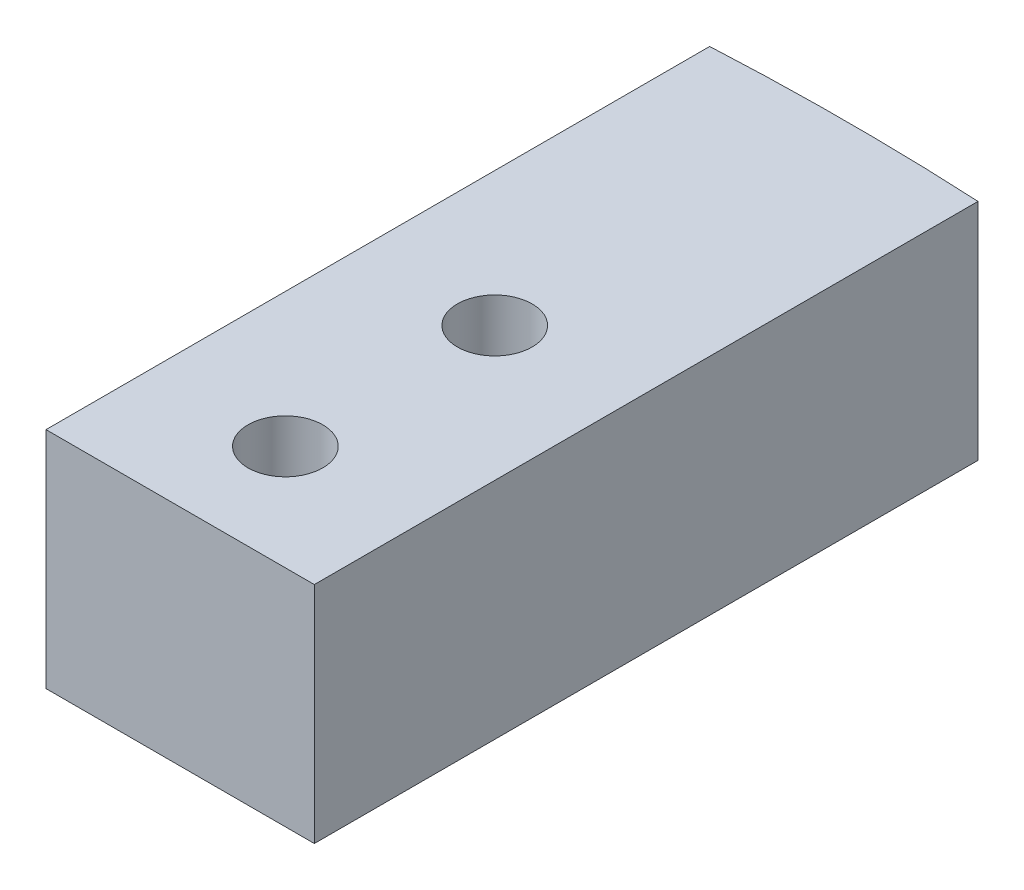
ISO-10303-21;
HEADER;
FILE_DESCRIPTION(('STEP AP214'),'2;1');
FILE_NAME('part.step','',(''),(''),'','','');
FILE_SCHEMA(('AUTOMOTIVE_DESIGN { 1 0 10303 214 1 1 1 1 }'));
ENDSEC;
DATA;
#1=APPLICATION_CONTEXT('core data for automotive mechanical design processes');
#2=APPLICATION_PROTOCOL_DEFINITION('international standard','automotive_design',2000,#1);
#3=PRODUCT_CONTEXT('',#1,'mechanical');
#4=PRODUCT('Part','Part','',(#3));
#5=PRODUCT_RELATED_PRODUCT_CATEGORY('part','',(#4));
#6=PRODUCT_DEFINITION_FORMATION('','',#4);
#7=PRODUCT_DEFINITION_CONTEXT('part definition',#1,'design');
#8=PRODUCT_DEFINITION('design','',#6,#7);
#9=PRODUCT_DEFINITION_SHAPE('','',#8);
#10=(LENGTH_UNIT() NAMED_UNIT(*) SI_UNIT(.MILLI.,.METRE.));
#11=(NAMED_UNIT(*) PLANE_ANGLE_UNIT() SI_UNIT($,.RADIAN.));
#12=(NAMED_UNIT(*) SI_UNIT($,.STERADIAN.) SOLID_ANGLE_UNIT());
#13=UNCERTAINTY_MEASURE_WITH_UNIT(LENGTH_MEASURE(1.E-05),#10,'distance_accuracy_value','');
#14=(GEOMETRIC_REPRESENTATION_CONTEXT(3) GLOBAL_UNCERTAINTY_ASSIGNED_CONTEXT((#13)) GLOBAL_UNIT_ASSIGNED_CONTEXT((#10,
#11,#12)) REPRESENTATION_CONTEXT('',''));
#15=CARTESIAN_POINT('',(0.,0.,0.));
#16=DIRECTION('',(0.,0.,1.));
#17=DIRECTION('',(1.,0.,0.));
#18=AXIS2_PLACEMENT_3D('',#15,#16,#17);
#19=CARTESIAN_POINT('',(0.,7.5,145.52623422));
#20=DIRECTION('',(0.,-1.,0.));
#21=DIRECTION('',(0.,0.,-1.));
#22=AXIS2_PLACEMENT_3D('',#19,#20,#21);
#23=CYLINDRICAL_SURFACE('',#22,174.10123422);
#24=CARTESIAN_POINT('',(2.5,0.,-28.5570497475518));
#25=CARTESIAN_POINT('',(2.49999377551294,0.140418330500894,-28.5570499901962));
#26=CARTESIAN_POINT('',(2.48812991610431,0.280938293282168,-28.5572214675525));
#27=CARTESIAN_POINT('',(2.44096755833609,0.558107692997246,-28.5578890338705));
#28=CARTESIAN_POINT('',(2.40564090188692,0.694752273313537,-28.5583855128616));
#29=CARTESIAN_POINT('',(2.31255930396923,0.960115343929164,-28.5596468287782));
#30=CARTESIAN_POINT('',(2.25481513463183,1.08883760671878,-28.5604115367965));
#31=CARTESIAN_POINT('',(2.11855260320089,1.33472477731036,-28.5621229776841));
#32=CARTESIAN_POINT('',(2.04003938514421,1.45189253705767,-28.5630696654653));
#33=CARTESIAN_POINT('',(1.86444561312543,1.67140650377812,-28.5650386425776));
#34=CARTESIAN_POINT('',(1.76736192259709,1.77375020181786,-28.5660609446622));
#35=CARTESIAN_POINT('',(1.5573867021884,1.96069039645708,-28.5680658115183));
#36=CARTESIAN_POINT('',(1.44449454981516,2.04528619386614,-28.569048374723));
#37=CARTESIAN_POINT('',(1.20610628474581,2.19432643181453,-28.5708629739851));
#38=CARTESIAN_POINT('',(1.0806098627555,2.25877037769106,-28.5716950063471));
#39=CARTESIAN_POINT('',(0.820577853294999,2.3656739422612,-28.5731147063998));
#40=CARTESIAN_POINT('',(0.686042288137301,2.40813361521921,-28.5737023746936));
#41=CARTESIAN_POINT('',(0.411760550377799,2.46986073982475,-28.5745670602259));
#42=CARTESIAN_POINT('',(0.272014732780737,2.48912976861902,-28.5748440985895));
#43=CARTESIAN_POINT('',(-0.0087283928125727,2.50393344980575,-28.5750563620433));
#44=CARTESIAN_POINT('',(-0.149725697925475,2.49946815686638,-28.5749915879207));
#45=CARTESIAN_POINT('',(-0.428958647919068,2.46693138686529,-28.5745275484519));
#46=CARTESIAN_POINT('',(-0.567194494780489,2.43886164281866,-28.574128307662));
#47=CARTESIAN_POINT('',(-0.836991602093441,2.35991543111861,-28.5730403703524));
#48=CARTESIAN_POINT('',(-0.968552853745246,2.30903893339783,-28.5723516734512));
#49=CARTESIAN_POINT('',(-1.22127160293703,2.18592145006987,-28.5707624210771));
#50=CARTESIAN_POINT('',(-1.34242871360763,2.11367967045584,-28.5698618577308));
#51=CARTESIAN_POINT('',(-1.57089563220674,1.94988296054732,-28.5679503951332));
#52=CARTESIAN_POINT('',(-1.67820543720312,1.85832802616333,-28.5669394958584));
#53=CARTESIAN_POINT('',(-1.87594174694973,1.65849408954525,-28.5649212139569));
#54=CARTESIAN_POINT('',(-1.96636672459858,1.55021357622923,-28.5639138316563));
#55=CARTESIAN_POINT('',(-2.12775475009575,1.32000755644447,-28.5620162499632));
#56=CARTESIAN_POINT('',(-2.19871779527737,1.19808204810606,-28.5611260505867));
#57=CARTESIAN_POINT('',(-2.31916734131849,0.944046307648136,-28.5595632077082));
#58=CARTESIAN_POINT('',(-2.36865379683236,0.811936054025258,-28.5588905646655));
#59=CARTESIAN_POINT('',(-2.44474443261169,0.541281402551808,-28.5578386926924));
#60=CARTESIAN_POINT('',(-2.47134862794374,0.402737008937787,-28.5574594635689));
#61=CARTESIAN_POINT('',(-2.50091767056486,0.123160183364879,-28.5570372088107));
#62=CARTESIAN_POINT('',(-2.50388462941387,-0.0178720252246148,-28.556994153145));
#63=CARTESIAN_POINT('',(-2.48610047528906,-0.298432661498268,-28.5572490212684));
#64=CARTESIAN_POINT('',(-2.46534936778176,-0.437961089529011,-28.5575469449788));
#65=CARTESIAN_POINT('',(-2.40071988596314,-0.711547508868859,-28.5584501568158));
#66=CARTESIAN_POINT('',(-2.35684246750863,-0.845605726026032,-28.559055432239));
#67=CARTESIAN_POINT('',(-2.24720688342412,-1.10445313825877,-28.5605050980802));
#68=CARTESIAN_POINT('',(-2.18144870988593,-1.22924232998428,-28.5613494885847));
#69=CARTESIAN_POINT('',(-2.02991284058702,-1.46601904719193,-28.5631822618318));
#70=CARTESIAN_POINT('',(-1.94413372307454,-1.57800566268007,-28.5641706547985));
#71=CARTESIAN_POINT('',(-1.75499302960464,-1.7859891749517,-28.566179965811));
#72=CARTESIAN_POINT('',(-1.65163143789282,-1.88198605740777,-28.567200883886));
#73=CARTESIAN_POINT('',(-1.43025086960687,-2.05527205488593,-28.5691602343703));
#74=CARTESIAN_POINT('',(-1.31223082438986,-2.13255980474641,-28.5700986607573));
#75=CARTESIAN_POINT('',(-1.06488914609038,-2.26622419153529,-28.5717871446295));
#76=CARTESIAN_POINT('',(-0.935567528048872,-2.32260085629318,-28.5725372023654));
#77=CARTESIAN_POINT('',(-0.669298855466579,-2.41284039992506,-28.5737643606336));
#78=CARTESIAN_POINT('',(-0.532352103460339,-2.44670417133097,-28.5742414719869));
#79=CARTESIAN_POINT('',(-0.254716152200741,-2.49095960427492,-28.5748689920594));
#80=CARTESIAN_POINT('',(-0.114026948498722,-2.50135123791031,-28.5750194003902));
#81=CARTESIAN_POINT('',(0.167086160887032,-2.49836722617772,-28.5749765570192));
#82=CARTESIAN_POINT('',(0.307510089727795,-2.4849937613964,-28.5747833368472));
#83=CARTESIAN_POINT('',(0.584119618434833,-2.434863600715,-28.5740750790014));
#84=CARTESIAN_POINT('',(0.720305209802225,-2.398106857929,-28.5735600406822));
#85=CARTESIAN_POINT('',(0.984574697231845,-2.30225318174905,-28.5722661909205));
#86=CARTESIAN_POINT('',(1.11265844420197,-2.24315583737746,-28.5714873746255));
#87=CARTESIAN_POINT('',(1.35708185455036,-2.10430121896847,-28.5697537933672));
#88=CARTESIAN_POINT('',(1.47342197046439,-2.02454474144454,-28.5687990351878));
#89=CARTESIAN_POINT('',(1.69106104708946,-1.84663689102714,-28.5668211707911));
#90=CARTESIAN_POINT('',(1.79236022856994,-1.74848578817613,-28.5657980655772));
#91=CARTESIAN_POINT('',(1.97706885114908,-1.53654151956128,-28.563798558287));
#92=CARTESIAN_POINT('',(2.06047384338581,-1.42274447540823,-28.5628221678717));
#93=CARTESIAN_POINT('',(2.20703015992689,-1.18271318039988,-28.5610259866248));
#94=CARTESIAN_POINT('',(2.27017100268337,-1.05647253712807,-28.560206276924));
#95=CARTESIAN_POINT('',(2.37428941574534,-0.795280011505882,-28.5588175325567));
#96=CARTESIAN_POINT('',(2.41529352359666,-0.660338777755686,-28.5582481978929));
#97=CARTESIAN_POINT('',(2.4630602040144,-0.437116066405007,-28.5575772149113));
#98=CARTESIAN_POINT('',(2.47689530695929,-0.350284692523687,-28.557380268417));
#99=CARTESIAN_POINT('',(2.49536715163534,-0.175648804080644,-28.5571164588436));
#100=CARTESIAN_POINT('',(2.50000389397625,-0.0878442895834298,-28.557049595756));
#101=CARTESIAN_POINT('',(2.5,0.,-28.5570497475518));
#102=B_SPLINE_CURVE_WITH_KNOTS('',3,(#24,#25,#26,#27,#28,#29,#30,#31,#32,#33,#34,#35,#36,#37,
#38,#39,#40,#41,#42,#43,#44,#45,#46,#47,#48,#49,#50,#51,#52,#53,#54,#55,#56,#57,#58,#59,#60,#61,
#62,#63,#64,#65,#66,#67,#68,#69,#70,#71,#72,#73,#74,#75,#76,#77,#78,#79,#80,#81,#82,#83,#84,#85,
#86,#87,#88,#89,#90,#91,#92,#93,#94,#95,#96,#97,#98,#99,#100,#101),.UNSPECIFIED.,.T.,.F.,(4,2,2,
2,2,2,2,2,2,2,2,2,2,2,2,2,2,2,2,2,2,2,2,2,2,2,2,2,2,2,2,2,2,2,2,2,2,2,4),(0.,0.420934357419994,
0.842374800129752,1.26361298116407,1.68474692828661,2.10595206814499,2.52717379854675,
2.94840586776873,3.36963689724661,3.79083927807269,4.21204068872751,4.63321117789716,
5.05438222231977,5.47556892086425,5.89675570859371,6.31798057096299,6.73920549104909,
7.1604313005045,7.58165683260814,8.00284473540024,8.42403254111712,8.84520293966228,
9.26637349042776,9.68757395897624,10.1087748049343,10.5300063756736,10.9512373858153,
11.3724516951028,11.793666505111,12.2148426681944,12.6360196757826,13.0572044317188,
13.478372951281,13.8995352883592,14.3208022139904,14.7422866883288,15.1632647581814,
15.4265970589435,15.6899293422495),.UNSPECIFIED.);
#103=CARTESIAN_POINT('',(2.5,0.,-28.5570497475518));
#104=VERTEX_POINT('',#103);
#105=EDGE_CURVE('E39',#104,#104,#102,.T.);
#106=ORIENTED_EDGE('',*,*,#105,.T.);
#107=EDGE_LOOP('',(#106));
#108=FACE_BOUND('',#107,.T.);
#109=CARTESIAN_POINT('',(0.,-7.5,145.52623422));
#110=DIRECTION('',(0.,1.,0.));
#111=DIRECTION('',(0.,0.,-1.));
#112=AXIS2_PLACEMENT_3D('',#109,#110,#111);
#113=CIRCLE('',#112,174.10123422);
#114=CARTESIAN_POINT('',(8.97267261568805,-7.5,-28.3436335060064));
#115=VERTEX_POINT('',#114);
#116=CARTESIAN_POINT('',(-8.97267261568805,-7.5,-28.3436335060064));
#117=VERTEX_POINT('',#116);
#118=EDGE_CURVE('E102',#115,#117,#113,.T.);
#119=ORIENTED_EDGE('',*,*,#118,.T.);
#120=DIRECTION('',(0.,-1.,0.));
#121=VECTOR('',#120,1.);
#122=CARTESIAN_POINT('',(-8.97267261568805,7.5,-28.3436335060064));
#123=LINE('',#122,#121);
#124=CARTESIAN_POINT('',(-8.97267261568805,7.5,-28.3436335060064));
#125=VERTEX_POINT('',#124);
#126=EDGE_CURVE('E11',#125,#117,#123,.T.);
#127=ORIENTED_EDGE('',*,*,#126,.F.);
#128=CARTESIAN_POINT('',(0.,7.5,145.52623422));
#129=DIRECTION('',(0.,1.,0.));
#130=DIRECTION('',(0.,0.,-1.));
#131=AXIS2_PLACEMENT_3D('',#128,#129,#130);
#132=CIRCLE('',#131,174.10123422);
#133=CARTESIAN_POINT('',(8.97267261568805,7.5,-28.3436335060064));
#134=VERTEX_POINT('',#133);
#135=EDGE_CURVE('E122',#134,#125,#132,.T.);
#136=ORIENTED_EDGE('',*,*,#135,.F.);
#137=DIRECTION('',(0.,-1.,0.));
#138=VECTOR('',#137,1.);
#139=CARTESIAN_POINT('',(8.97267261568805,7.5,-28.3436335060064));
#140=LINE('',#139,#138);
#141=EDGE_CURVE('E47',#134,#115,#140,.T.);
#142=ORIENTED_EDGE('',*,*,#141,.T.);
#143=EDGE_LOOP('',(#119,#127,#136,#142));
#144=FACE_BOUND('',#143,.T.);
#145=ADVANCED_FACE('F35',(#108,#144),#23,.T.);
#146=CARTESIAN_POINT('',(0.,7.5,145.52623422));
#147=DIRECTION('',(0.,-1.,0.));
#148=DIRECTION('',(0.,0.,-1.));
#149=AXIS2_PLACEMENT_3D('',#146,#147,#148);
#150=PLANE('',#149);
#151=ORIENTED_EDGE('',*,*,#135,.T.);
#152=DIRECTION('',(0.,0.,1.));
#153=VECTOR('',#152,1.);
#154=CARTESIAN_POINT('',(-8.97267261568805,7.5,-28.3436335060064));
#155=LINE('',#154,#153);
#156=CARTESIAN_POINT('',(-8.97267261568805,7.5,16.0373367171762));
#157=VERTEX_POINT('',#156);
#158=EDGE_CURVE('E75',#125,#157,#155,.T.);
#159=ORIENTED_EDGE('',*,*,#158,.T.);
#160=DIRECTION('',(1.,0.,0.));
#161=VECTOR('',#160,1.);
#162=CARTESIAN_POINT('',(-8.97267261568805,7.5,16.0373367171762));
#163=LINE('',#162,#161);
#164=CARTESIAN_POINT('',(8.97267261568806,7.5,16.0373367171762));
#165=VERTEX_POINT('',#164);
#166=EDGE_CURVE('E108',#157,#165,#163,.T.);
#167=ORIENTED_EDGE('',*,*,#166,.T.);
#168=DIRECTION('',(0.,0.,-1.));
#169=VECTOR('',#168,1.);
#170=CARTESIAN_POINT('',(8.97267261568805,7.5,-28.3436335060064));
#171=LINE('',#170,#169);
#172=EDGE_CURVE('E54',#165,#134,#171,.T.);
#173=ORIENTED_EDGE('',*,*,#172,.T.);
#174=EDGE_LOOP('',(#151,#159,#167,#173));
#175=FACE_BOUND('',#174,.T.);
#176=CARTESIAN_POINT('',(0.,7.5,-5.));
#177=DIRECTION('',(0.,1.,0.));
#178=DIRECTION('',(0.,0.,1.));
#179=AXIS2_PLACEMENT_3D('',#176,#177,#178);
#180=CIRCLE('',#179,2.5);
#181=CARTESIAN_POINT('',(0.,7.5,-2.5));
#182=VERTEX_POINT('',#181);
#183=EDGE_CURVE('E116',#182,#182,#180,.T.);
#184=ORIENTED_EDGE('',*,*,#183,.F.);
#185=EDGE_LOOP('',(#184));
#186=FACE_BOUND('',#185,.T.);
#187=CARTESIAN_POINT('',(0.,7.5,9.00123421999999));
#188=DIRECTION('',(0.,1.,0.));
#189=DIRECTION('',(0.,0.,1.));
#190=AXIS2_PLACEMENT_3D('',#187,#188,#189);
#191=CIRCLE('',#190,2.5);
#192=CARTESIAN_POINT('',(0.,7.5,11.50123422));
#193=VERTEX_POINT('',#192);
#194=EDGE_CURVE('E96',#193,#193,#191,.T.);
#195=ORIENTED_EDGE('',*,*,#194,.F.);
#196=EDGE_LOOP('',(#195));
#197=FACE_BOUND('',#196,.T.);
#198=ADVANCED_FACE('F127',(#175,#186,#197),#150,.F.);
#199=CARTESIAN_POINT('',(0.,-7.5,145.52623422));
#200=DIRECTION('',(0.,-1.,0.));
#201=DIRECTION('',(0.,0.,-1.));
#202=AXIS2_PLACEMENT_3D('',#199,#200,#201);
#203=PLANE('',#202);
#204=ORIENTED_EDGE('',*,*,#118,.F.);
#205=DIRECTION('',(0.,0.,-1.));
#206=VECTOR('',#205,1.);
#207=CARTESIAN_POINT('',(8.97267261568805,-7.5,-28.3436335060064));
#208=LINE('',#207,#206);
#209=CARTESIAN_POINT('',(8.97267261568806,-7.5,16.0373367171762));
#210=VERTEX_POINT('',#209);
#211=EDGE_CURVE('E90',#210,#115,#208,.T.);
#212=ORIENTED_EDGE('',*,*,#211,.F.);
#213=DIRECTION('',(1.,0.,0.));
#214=VECTOR('',#213,1.);
#215=CARTESIAN_POINT('',(-8.97267261568805,-7.5,16.0373367171762));
#216=LINE('',#215,#214);
#217=CARTESIAN_POINT('',(-8.97267261568805,-7.5,16.0373367171762));
#218=VERTEX_POINT('',#217);
#219=EDGE_CURVE('E84',#218,#210,#216,.T.);
#220=ORIENTED_EDGE('',*,*,#219,.F.);
#221=DIRECTION('',(0.,0.,1.));
#222=VECTOR('',#221,1.);
#223=CARTESIAN_POINT('',(-8.97267261568805,-7.5,-28.3436335060064));
#224=LINE('',#223,#222);
#225=EDGE_CURVE('E91',#117,#218,#224,.T.);
#226=ORIENTED_EDGE('',*,*,#225,.F.);
#227=EDGE_LOOP('',(#204,#212,#220,#226));
#228=FACE_BOUND('',#227,.T.);
#229=CARTESIAN_POINT('',(0.,-7.5,9.00123421999999));
#230=DIRECTION('',(0.,1.,0.));
#231=DIRECTION('',(0.,0.,1.));
#232=AXIS2_PLACEMENT_3D('',#229,#230,#231);
#233=CIRCLE('',#232,2.5);
#234=CARTESIAN_POINT('',(0.,-7.5,11.50123422));
#235=VERTEX_POINT('',#234);
#236=EDGE_CURVE('E113',#235,#235,#233,.T.);
#237=ORIENTED_EDGE('',*,*,#236,.T.);
#238=EDGE_LOOP('',(#237));
#239=FACE_BOUND('',#238,.T.);
#240=CARTESIAN_POINT('',(0.,-7.5,-5.));
#241=DIRECTION('',(0.,1.,0.));
#242=DIRECTION('',(0.,0.,1.));
#243=AXIS2_PLACEMENT_3D('',#240,#241,#242);
#244=CIRCLE('',#243,2.5);
#245=CARTESIAN_POINT('',(0.,-7.5,-2.5));
#246=VERTEX_POINT('',#245);
#247=EDGE_CURVE('E119',#246,#246,#244,.T.);
#248=ORIENTED_EDGE('',*,*,#247,.T.);
#249=EDGE_LOOP('',(#248));
#250=FACE_BOUND('',#249,.T.);
#251=ADVANCED_FACE('F99',(#228,#239,#250),#203,.T.);
#252=CARTESIAN_POINT('',(0.,7.5,-5.));
#253=DIRECTION('',(0.,1.,0.));
#254=DIRECTION('',(0.,0.,1.));
#255=AXIS2_PLACEMENT_3D('',#252,#253,#254);
#256=CYLINDRICAL_SURFACE('',#255,2.5);
#257=ORIENTED_EDGE('',*,*,#247,.F.);
#258=EDGE_LOOP('',(#257));
#259=FACE_BOUND('',#258,.T.);
#260=ORIENTED_EDGE('',*,*,#183,.T.);
#261=EDGE_LOOP('',(#260));
#262=FACE_BOUND('',#261,.T.);
#263=ADVANCED_FACE('F137',(#259,#262),#256,.F.);
#264=CARTESIAN_POINT('',(0.,7.5,9.00123421999999));
#265=DIRECTION('',(0.,1.,0.));
#266=DIRECTION('',(0.,0.,1.));
#267=AXIS2_PLACEMENT_3D('',#264,#265,#266);
#268=CYLINDRICAL_SURFACE('',#267,2.5);
#269=ORIENTED_EDGE('',*,*,#236,.F.);
#270=EDGE_LOOP('',(#269));
#271=FACE_BOUND('',#270,.T.);
#272=ORIENTED_EDGE('',*,*,#194,.T.);
#273=EDGE_LOOP('',(#272));
#274=FACE_BOUND('',#273,.T.);
#275=ADVANCED_FACE('F135',(#271,#274),#268,.F.);
#276=CARTESIAN_POINT('',(-8.97267261568805,-7.5,16.0373367171762));
#277=DIRECTION('',(0.,0.,1.));
#278=DIRECTION('',(1.,0.,0.));
#279=AXIS2_PLACEMENT_3D('',#276,#277,#278);
#280=PLANE('',#279);
#281=ORIENTED_EDGE('',*,*,#219,.T.);
#282=DIRECTION('',(0.,1.,0.));
#283=VECTOR('',#282,1.);
#284=CARTESIAN_POINT('',(8.97267261568806,-7.5,16.0373367171762));
#285=LINE('',#284,#283);
#286=EDGE_CURVE('E87',#210,#165,#285,.T.);
#287=ORIENTED_EDGE('',*,*,#286,.T.);
#288=ORIENTED_EDGE('',*,*,#166,.F.);
#289=DIRECTION('',(0.,1.,0.));
#290=VECTOR('',#289,1.);
#291=CARTESIAN_POINT('',(-8.97267261568805,-7.5,16.0373367171762));
#292=LINE('',#291,#290);
#293=EDGE_CURVE('E81',#218,#157,#292,.T.);
#294=ORIENTED_EDGE('',*,*,#293,.F.);
#295=EDGE_LOOP('',(#281,#287,#288,#294));
#296=FACE_BOUND('',#295,.T.);
#297=ADVANCED_FACE('F86',(#296),#280,.T.);
#298=CARTESIAN_POINT('',(-8.97267261568805,-7.5,-28.3436335060064));
#299=DIRECTION('',(-1.,0.,0.));
#300=DIRECTION('',(0.,0.,1.));
#301=AXIS2_PLACEMENT_3D('',#298,#299,#300);
#302=PLANE('',#301);
#303=ORIENTED_EDGE('',*,*,#158,.F.);
#304=ORIENTED_EDGE('',*,*,#126,.T.);
#305=ORIENTED_EDGE('',*,*,#225,.T.);
#306=ORIENTED_EDGE('',*,*,#293,.T.);
#307=EDGE_LOOP('',(#303,#304,#305,#306));
#308=FACE_BOUND('',#307,.T.);
#309=ADVANCED_FACE('F144',(#308),#302,.T.);
#310=CARTESIAN_POINT('',(8.97267261568805,-7.5,-28.3436335060064));
#311=DIRECTION('',(1.,0.,0.));
#312=DIRECTION('',(0.,0.,-1.));
#313=AXIS2_PLACEMENT_3D('',#310,#311,#312);
#314=PLANE('',#313);
#315=ORIENTED_EDGE('',*,*,#172,.F.);
#316=ORIENTED_EDGE('',*,*,#286,.F.);
#317=ORIENTED_EDGE('',*,*,#211,.T.);
#318=ORIENTED_EDGE('',*,*,#141,.F.);
#319=EDGE_LOOP('',(#315,#316,#317,#318));
#320=FACE_BOUND('',#319,.T.);
#321=ADVANCED_FACE('F94',(#320),#314,.T.);
#322=CARTESIAN_POINT('',(0.,0.,-35.));
#323=DIRECTION('',(0.,0.,1.));
#324=DIRECTION('',(1.,0.,0.));
#325=AXIS2_PLACEMENT_3D('',#322,#323,#324);
#326=CYLINDRICAL_SURFACE('',#325,2.5);
#327=CARTESIAN_POINT('',(0.,0.,-15.));
#328=DIRECTION('',(0.,0.,1.));
#329=DIRECTION('',(1.,0.,0.));
#330=AXIS2_PLACEMENT_3D('',#327,#328,#329);
#331=CIRCLE('',#330,2.5);
#332=CARTESIAN_POINT('',(2.5,0.,-15.));
#333=VERTEX_POINT('',#332);
#334=EDGE_CURVE('E157',#333,#333,#331,.T.);
#335=ORIENTED_EDGE('',*,*,#334,.T.);
#336=EDGE_LOOP('',(#335));
#337=FACE_BOUND('',#336,.T.);
#338=ORIENTED_EDGE('',*,*,#105,.F.);
#339=EDGE_LOOP('',(#338));
#340=FACE_BOUND('',#339,.T.);
#341=ADVANCED_FACE('F166',(#337,#340),#326,.F.);
#342=CARTESIAN_POINT('',(0.,0.,-15.));
#343=DIRECTION('',(0.,0.,1.));
#344=DIRECTION('',(1.,0.,0.));
#345=AXIS2_PLACEMENT_3D('',#342,#343,#344);
#346=PLANE('',#345);
#347=ORIENTED_EDGE('',*,*,#334,.F.);
#348=EDGE_LOOP('',(#347));
#349=FACE_BOUND('',#348,.T.);
#350=ADVANCED_FACE('F171',(#349),#346,.F.);
#351=CLOSED_SHELL('',(#145,#198,#251,#263,#275,#297,#309,#321,#341,#350));
#352=MANIFOLD_SOLID_BREP('B2',#351);
#353=ADVANCED_BREP_SHAPE_REPRESENTATION('',(#18,#352),#14);
#354=SHAPE_DEFINITION_REPRESENTATION(#9,#353);
ENDSEC;
END-ISO-10303-21;
